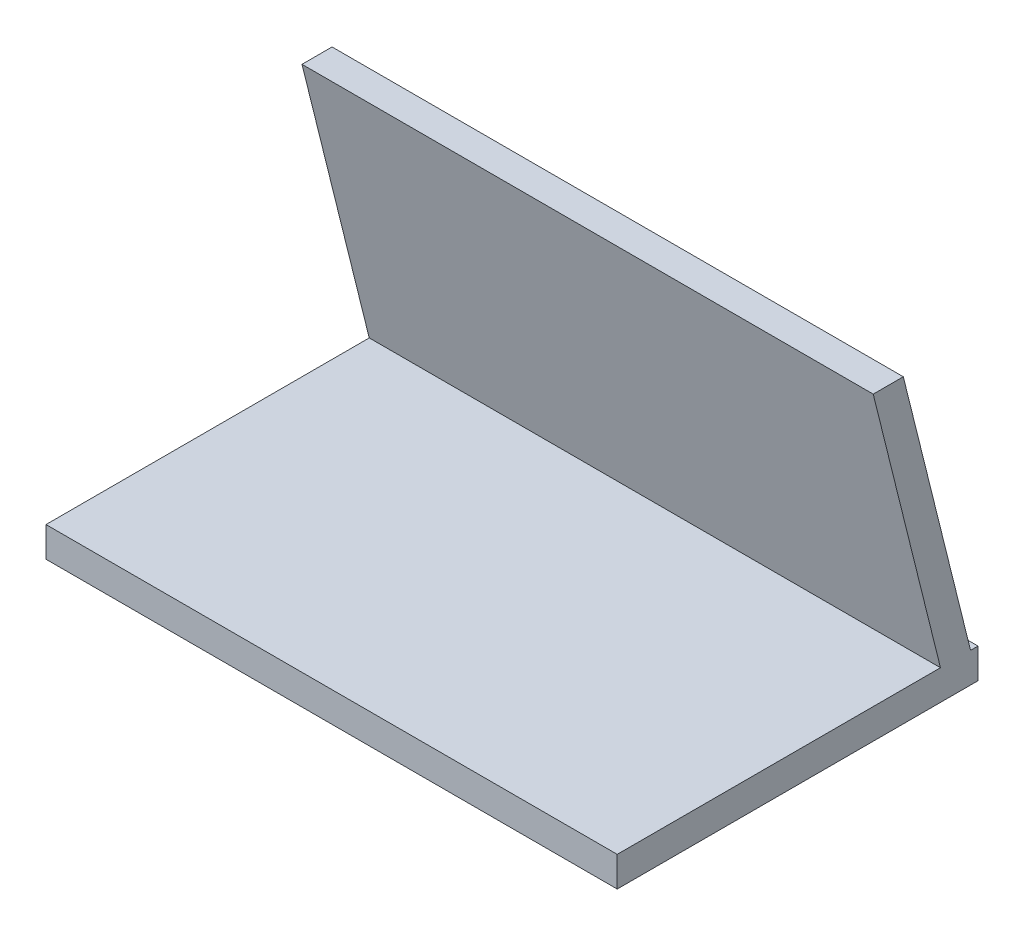
ISO-10303-21;
HEADER;
FILE_DESCRIPTION(('STEP AP214'),'2;1');
FILE_NAME('part.step','',(''),(''),'','','');
FILE_SCHEMA(('AUTOMOTIVE_DESIGN { 1 0 10303 214 1 1 1 1 }'));
ENDSEC;
DATA;
#1=APPLICATION_CONTEXT('core data for automotive mechanical design processes');
#2=APPLICATION_PROTOCOL_DEFINITION('international standard','automotive_design',2000,#1);
#3=PRODUCT_CONTEXT('',#1,'mechanical');
#4=PRODUCT('Part','Part','',(#3));
#5=PRODUCT_RELATED_PRODUCT_CATEGORY('part','',(#4));
#6=PRODUCT_DEFINITION_FORMATION('','',#4);
#7=PRODUCT_DEFINITION_CONTEXT('part definition',#1,'design');
#8=PRODUCT_DEFINITION('design','',#6,#7);
#9=PRODUCT_DEFINITION_SHAPE('','',#8);
#10=(LENGTH_UNIT() NAMED_UNIT(*) SI_UNIT(.MILLI.,.METRE.));
#11=(NAMED_UNIT(*) PLANE_ANGLE_UNIT() SI_UNIT($,.RADIAN.));
#12=(NAMED_UNIT(*) SI_UNIT($,.STERADIAN.) SOLID_ANGLE_UNIT());
#13=UNCERTAINTY_MEASURE_WITH_UNIT(LENGTH_MEASURE(1.E-05),#10,'distance_accuracy_value','');
#14=(GEOMETRIC_REPRESENTATION_CONTEXT(3) GLOBAL_UNCERTAINTY_ASSIGNED_CONTEXT((#13)) GLOBAL_UNIT_ASSIGNED_CONTEXT((#10,
#11,#12)) REPRESENTATION_CONTEXT('',''));
#15=CARTESIAN_POINT('',(0.,0.,0.));
#16=DIRECTION('',(0.,0.,1.));
#17=DIRECTION('',(1.,0.,0.));
#18=AXIS2_PLACEMENT_3D('',#15,#16,#17);
#19=CARTESIAN_POINT('',(0.,5.,0.));
#20=DIRECTION('',(0.,1.,0.));
#21=DIRECTION('',(0.,0.,1.));
#22=AXIS2_PLACEMENT_3D('',#19,#20,#21);
#23=PLANE('',#22);
#24=DIRECTION('',(-1.,0.,0.));
#25=VECTOR('',#24,1.);
#26=CARTESIAN_POINT('',(0.,5.,1.24244678480143));
#27=LINE('',#26,#25);
#28=CARTESIAN_POINT('',(95.,5.,1.24244678480141));
#29=VERTEX_POINT('',#28);
#30=CARTESIAN_POINT('',(0.,5.,1.24244678480143));
#31=VERTEX_POINT('',#30);
#32=EDGE_CURVE('E55',#29,#31,#27,.T.);
#33=ORIENTED_EDGE('',*,*,#32,.F.);
#34=DIRECTION('',(0.,0.,-1.));
#35=VECTOR('',#34,1.);
#36=CARTESIAN_POINT('',(95.,5.,0.));
#37=LINE('',#36,#35);
#38=CARTESIAN_POINT('',(95.,5.,0.));
#39=VERTEX_POINT('',#38);
#40=EDGE_CURVE('E158',#29,#39,#37,.T.);
#41=ORIENTED_EDGE('',*,*,#40,.T.);
#42=DIRECTION('',(-1.,0.,0.));
#43=VECTOR('',#42,1.);
#44=CARTESIAN_POINT('',(0.,5.,0.));
#45=LINE('',#44,#43);
#46=CARTESIAN_POINT('',(0.,5.,0.));
#47=VERTEX_POINT('',#46);
#48=EDGE_CURVE('E161',#39,#47,#45,.T.);
#49=ORIENTED_EDGE('',*,*,#48,.T.);
#50=DIRECTION('',(0.,0.,1.));
#51=VECTOR('',#50,1.);
#52=CARTESIAN_POINT('',(0.,5.,0.));
#53=LINE('',#52,#51);
#54=EDGE_CURVE('E151',#47,#31,#53,.T.);
#55=ORIENTED_EDGE('',*,*,#54,.T.);
#56=EDGE_LOOP('',(#33,#41,#49,#55));
#57=FACE_BOUND('',#56,.T.);
#58=ADVANCED_FACE('F39',(#57),#23,.T.);
#59=CARTESIAN_POINT('',(0.,5.,0.));
#60=DIRECTION('',(1.,0.,0.));
#61=DIRECTION('',(0.,0.,-1.));
#62=AXIS2_PLACEMENT_3D('',#59,#60,#61);
#63=PLANE('',#62);
#64=CARTESIAN_POINT('',(0.,5.,6.24244678480142));
#65=VERTEX_POINT('',#64);
#66=CARTESIAN_POINT('',(0.,5.,60.));
#67=VERTEX_POINT('',#66);
#68=EDGE_CURVE('E155',#65,#67,#53,.T.);
#69=ORIENTED_EDGE('',*,*,#68,.F.);
#70=DIRECTION('',(0.,0.970486473869106,0.241155559830389));
#71=VECTOR('',#70,1.);
#72=CARTESIAN_POINT('',(0.,45.,16.1820210632128));
#73=LINE('',#72,#71);
#74=CARTESIAN_POINT('',(0.,50.,17.4244678480143));
#75=VERTEX_POINT('',#74);
#76=EDGE_CURVE('E136',#65,#75,#73,.T.);
#77=ORIENTED_EDGE('',*,*,#76,.T.);
#78=DIRECTION('',(0.,0.,-1.));
#79=VECTOR('',#78,1.);
#80=CARTESIAN_POINT('',(0.,50.,12.4244678480143));
#81=LINE('',#80,#79);
#82=CARTESIAN_POINT('',(0.,50.,12.4244678480143));
#83=VERTEX_POINT('',#82);
#84=EDGE_CURVE('E124',#75,#83,#81,.T.);
#85=ORIENTED_EDGE('',*,*,#84,.T.);
#86=DIRECTION('',(0.,-0.970486473869106,-0.241155559830389));
#87=VECTOR('',#86,1.);
#88=CARTESIAN_POINT('',(0.,0.,0.));
#89=LINE('',#88,#87);
#90=EDGE_CURVE('E117',#83,#31,#89,.T.);
#91=ORIENTED_EDGE('',*,*,#90,.T.);
#92=ORIENTED_EDGE('',*,*,#54,.F.);
#93=DIRECTION('',(0.,-1.,0.));
#94=VECTOR('',#93,1.);
#95=CARTESIAN_POINT('',(0.,5.,0.));
#96=LINE('',#95,#94);
#97=CARTESIAN_POINT('',(0.,0.,0.));
#98=VERTEX_POINT('',#97);
#99=EDGE_CURVE('E164',#47,#98,#96,.T.);
#100=ORIENTED_EDGE('',*,*,#99,.T.);
#101=DIRECTION('',(0.,0.,1.));
#102=VECTOR('',#101,1.);
#103=CARTESIAN_POINT('',(0.,0.,0.));
#104=LINE('',#103,#102);
#105=CARTESIAN_POINT('',(0.,0.,60.));
#106=VERTEX_POINT('',#105);
#107=EDGE_CURVE('E150',#98,#106,#104,.T.);
#108=ORIENTED_EDGE('',*,*,#107,.T.);
#109=DIRECTION('',(0.,-1.,0.));
#110=VECTOR('',#109,1.);
#111=CARTESIAN_POINT('',(0.,5.,60.));
#112=LINE('',#111,#110);
#113=EDGE_CURVE('E11',#67,#106,#112,.T.);
#114=ORIENTED_EDGE('',*,*,#113,.F.);
#115=EDGE_LOOP('',(#69,#77,#85,#91,#92,#100,#108,#114));
#116=FACE_BOUND('',#115,.T.);
#117=ADVANCED_FACE('F41',(#116),#63,.F.);
#118=CARTESIAN_POINT('',(0.,5.,60.));
#119=DIRECTION('',(0.,0.,-1.));
#120=DIRECTION('',(-1.,0.,0.));
#121=AXIS2_PLACEMENT_3D('',#118,#119,#120);
#122=PLANE('',#121);
#123=DIRECTION('',(1.,0.,0.));
#124=VECTOR('',#123,1.);
#125=CARTESIAN_POINT('',(0.,0.,60.));
#126=LINE('',#125,#124);
#127=CARTESIAN_POINT('',(95.,0.,60.));
#128=VERTEX_POINT('',#127);
#129=EDGE_CURVE('E167',#106,#128,#126,.T.);
#130=ORIENTED_EDGE('',*,*,#129,.T.);
#131=DIRECTION('',(0.,-1.,0.));
#132=VECTOR('',#131,1.);
#133=CARTESIAN_POINT('',(95.,5.,60.));
#134=LINE('',#133,#132);
#135=CARTESIAN_POINT('',(95.,5.,60.));
#136=VERTEX_POINT('',#135);
#137=EDGE_CURVE('E48',#136,#128,#134,.T.);
#138=ORIENTED_EDGE('',*,*,#137,.F.);
#139=DIRECTION('',(1.,0.,0.));
#140=VECTOR('',#139,1.);
#141=CARTESIAN_POINT('',(0.,5.,60.));
#142=LINE('',#141,#140);
#143=EDGE_CURVE('E154',#67,#136,#142,.T.);
#144=ORIENTED_EDGE('',*,*,#143,.F.);
#145=ORIENTED_EDGE('',*,*,#113,.T.);
#146=EDGE_LOOP('',(#130,#138,#144,#145));
#147=FACE_BOUND('',#146,.T.);
#148=ADVANCED_FACE('F219',(#147),#122,.F.);
#149=CARTESIAN_POINT('',(95.,5.,0.));
#150=DIRECTION('',(-1.,0.,0.));
#151=DIRECTION('',(0.,0.,1.));
#152=AXIS2_PLACEMENT_3D('',#149,#150,#151);
#153=PLANE('',#152);
#154=DIRECTION('',(0.,0.,-1.));
#155=VECTOR('',#154,1.);
#156=CARTESIAN_POINT('',(95.,0.,0.));
#157=LINE('',#156,#155);
#158=CARTESIAN_POINT('',(95.,0.,0.));
#159=VERTEX_POINT('',#158);
#160=EDGE_CURVE('E170',#128,#159,#157,.T.);
#161=ORIENTED_EDGE('',*,*,#160,.T.);
#162=DIRECTION('',(0.,-1.,0.));
#163=VECTOR('',#162,1.);
#164=CARTESIAN_POINT('',(95.,5.,0.));
#165=LINE('',#164,#163);
#166=EDGE_CURVE('E179',#39,#159,#165,.T.);
#167=ORIENTED_EDGE('',*,*,#166,.F.);
#168=ORIENTED_EDGE('',*,*,#40,.F.);
#169=DIRECTION('',(0.,-0.970486473869106,-0.241155559830389));
#170=VECTOR('',#169,1.);
#171=CARTESIAN_POINT('',(95.,0.,0.));
#172=LINE('',#171,#170);
#173=CARTESIAN_POINT('',(95.,50.,12.4244678480142));
#174=VERTEX_POINT('',#173);
#175=EDGE_CURVE('E127',#174,#29,#172,.T.);
#176=ORIENTED_EDGE('',*,*,#175,.F.);
#177=DIRECTION('',(0.,0.,-1.));
#178=VECTOR('',#177,1.);
#179=CARTESIAN_POINT('',(95.,50.,12.4244678480142));
#180=LINE('',#179,#178);
#181=CARTESIAN_POINT('',(95.,50.,17.4244678480143));
#182=VERTEX_POINT('',#181);
#183=EDGE_CURVE('E116',#182,#174,#180,.T.);
#184=ORIENTED_EDGE('',*,*,#183,.F.);
#185=DIRECTION('',(0.,0.970486473869106,0.241155559830389));
#186=VECTOR('',#185,1.);
#187=CARTESIAN_POINT('',(95.,45.,16.1820210632128));
#188=LINE('',#187,#186);
#189=CARTESIAN_POINT('',(95.,5.,6.24244678480142));
#190=VERTEX_POINT('',#189);
#191=EDGE_CURVE('E106',#190,#182,#188,.T.);
#192=ORIENTED_EDGE('',*,*,#191,.F.);
#193=EDGE_CURVE('E63',#136,#190,#37,.T.);
#194=ORIENTED_EDGE('',*,*,#193,.F.);
#195=ORIENTED_EDGE('',*,*,#137,.T.);
#196=EDGE_LOOP('',(#161,#167,#168,#176,#184,#192,#194,#195));
#197=FACE_BOUND('',#196,.T.);
#198=ADVANCED_FACE('F129',(#197),#153,.F.);
#199=CARTESIAN_POINT('',(0.,5.,0.));
#200=DIRECTION('',(0.,0.,1.));
#201=DIRECTION('',(1.,0.,0.));
#202=AXIS2_PLACEMENT_3D('',#199,#200,#201);
#203=PLANE('',#202);
#204=DIRECTION('',(-1.,0.,0.));
#205=VECTOR('',#204,1.);
#206=CARTESIAN_POINT('',(0.,0.,0.));
#207=LINE('',#206,#205);
#208=EDGE_CURVE('E173',#159,#98,#207,.T.);
#209=ORIENTED_EDGE('',*,*,#208,.T.);
#210=ORIENTED_EDGE('',*,*,#99,.F.);
#211=ORIENTED_EDGE('',*,*,#48,.F.);
#212=ORIENTED_EDGE('',*,*,#166,.T.);
#213=EDGE_LOOP('',(#209,#210,#211,#212));
#214=FACE_BOUND('',#213,.T.);
#215=ADVANCED_FACE('F196',(#214),#203,.F.);
#216=DIRECTION('',(1.,0.,0.));
#217=VECTOR('',#216,1.);
#218=CARTESIAN_POINT('',(0.,5.,6.24244678480142));
#219=LINE('',#218,#217);
#220=EDGE_CURVE('E112',#65,#190,#219,.T.);
#221=ORIENTED_EDGE('',*,*,#220,.F.);
#222=ORIENTED_EDGE('',*,*,#68,.T.);
#223=ORIENTED_EDGE('',*,*,#143,.T.);
#224=ORIENTED_EDGE('',*,*,#193,.T.);
#225=EDGE_LOOP('',(#221,#222,#223,#224));
#226=FACE_BOUND('',#225,.T.);
#227=ADVANCED_FACE('F205',(#226),#23,.T.);
#228=CARTESIAN_POINT('',(0.,0.,0.));
#229=DIRECTION('',(0.,1.,0.));
#230=DIRECTION('',(0.,0.,1.));
#231=AXIS2_PLACEMENT_3D('',#228,#229,#230);
#232=PLANE('',#231);
#233=ORIENTED_EDGE('',*,*,#129,.F.);
#234=ORIENTED_EDGE('',*,*,#107,.F.);
#235=ORIENTED_EDGE('',*,*,#208,.F.);
#236=ORIENTED_EDGE('',*,*,#160,.F.);
#237=EDGE_LOOP('',(#233,#234,#235,#236));
#238=FACE_BOUND('',#237,.T.);
#239=ADVANCED_FACE('F192',(#238),#232,.F.);
#240=CARTESIAN_POINT('',(95.,0.,0.));
#241=DIRECTION('',(0.,0.241155559830389,-0.970486473869106));
#242=DIRECTION('',(0.,0.970486473869106,0.241155559830389));
#243=AXIS2_PLACEMENT_3D('',#240,#241,#242);
#244=PLANE('',#243);
#245=ORIENTED_EDGE('',*,*,#175,.T.);
#246=ORIENTED_EDGE('',*,*,#32,.T.);
#247=ORIENTED_EDGE('',*,*,#90,.F.);
#248=DIRECTION('',(-1.,0.,0.));
#249=VECTOR('',#248,1.);
#250=CARTESIAN_POINT('',(95.,50.,12.4244678480142));
#251=LINE('',#250,#249);
#252=EDGE_CURVE('E126',#174,#83,#251,.T.);
#253=ORIENTED_EDGE('',*,*,#252,.F.);
#254=EDGE_LOOP('',(#245,#246,#247,#253));
#255=FACE_BOUND('',#254,.T.);
#256=ADVANCED_FACE('F203',(#255),#244,.T.);
#257=CARTESIAN_POINT('',(95.,50.,12.4244678480142));
#258=DIRECTION('',(0.,1.,0.));
#259=DIRECTION('',(0.,0.,1.));
#260=AXIS2_PLACEMENT_3D('',#257,#258,#259);
#261=PLANE('',#260);
#262=ORIENTED_EDGE('',*,*,#84,.F.);
#263=DIRECTION('',(-1.,0.,0.));
#264=VECTOR('',#263,1.);
#265=CARTESIAN_POINT('',(95.,50.,17.4244678480143));
#266=LINE('',#265,#264);
#267=EDGE_CURVE('E110',#182,#75,#266,.T.);
#268=ORIENTED_EDGE('',*,*,#267,.F.);
#269=ORIENTED_EDGE('',*,*,#183,.T.);
#270=ORIENTED_EDGE('',*,*,#252,.T.);
#271=EDGE_LOOP('',(#262,#268,#269,#270));
#272=FACE_BOUND('',#271,.T.);
#273=ADVANCED_FACE('F121',(#272),#261,.T.);
#274=CARTESIAN_POINT('',(95.,45.,16.1820210632128));
#275=DIRECTION('',(0.,-0.241155559830389,0.970486473869106));
#276=DIRECTION('',(0.,-0.970486473869106,-0.241155559830389));
#277=AXIS2_PLACEMENT_3D('',#274,#275,#276);
#278=PLANE('',#277);
#279=ORIENTED_EDGE('',*,*,#76,.F.);
#280=ORIENTED_EDGE('',*,*,#220,.T.);
#281=ORIENTED_EDGE('',*,*,#191,.T.);
#282=ORIENTED_EDGE('',*,*,#267,.T.);
#283=EDGE_LOOP('',(#279,#280,#281,#282));
#284=FACE_BOUND('',#283,.T.);
#285=ADVANCED_FACE('F109',(#284),#278,.T.);
#286=CLOSED_SHELL('',(#58,#117,#148,#198,#215,#227,#239,#256,#273,#285));
#287=MANIFOLD_SOLID_BREP('B2',#286);
#288=ADVANCED_BREP_SHAPE_REPRESENTATION('',(#18,#287),#14);
#289=SHAPE_DEFINITION_REPRESENTATION(#9,#288);
ENDSEC;
END-ISO-10303-21;
